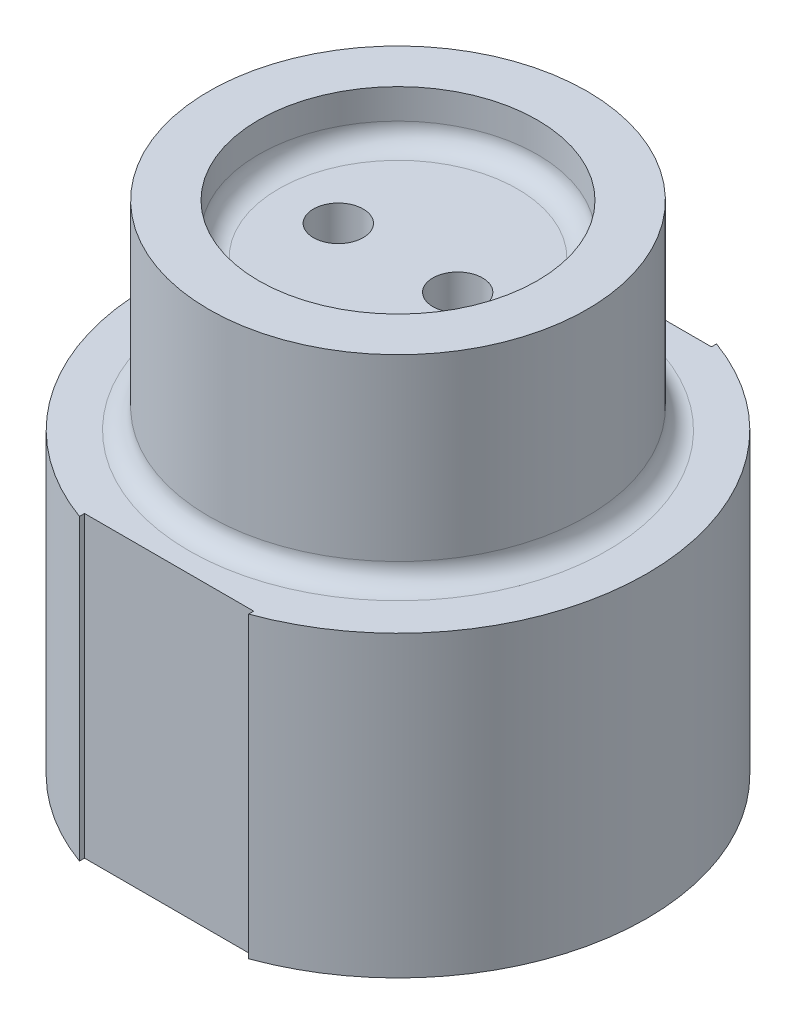
ISO-10303-21;
HEADER;
FILE_DESCRIPTION(('STEP AP214'),'2;1');
FILE_NAME('part.step','',(''),(''),'','','');
FILE_SCHEMA(('AUTOMOTIVE_DESIGN { 1 0 10303 214 1 1 1 1 }'));
ENDSEC;
DATA;
#1=APPLICATION_CONTEXT('core data for automotive mechanical design processes');
#2=APPLICATION_PROTOCOL_DEFINITION('international standard','automotive_design',2000,#1);
#3=PRODUCT_CONTEXT('',#1,'mechanical');
#4=PRODUCT('Part','Part','',(#3));
#5=PRODUCT_RELATED_PRODUCT_CATEGORY('part','',(#4));
#6=PRODUCT_DEFINITION_FORMATION('','',#4);
#7=PRODUCT_DEFINITION_CONTEXT('part definition',#1,'design');
#8=PRODUCT_DEFINITION('design','',#6,#7);
#9=PRODUCT_DEFINITION_SHAPE('','',#8);
#10=(LENGTH_UNIT() NAMED_UNIT(*) SI_UNIT(.MILLI.,.METRE.));
#11=(NAMED_UNIT(*) PLANE_ANGLE_UNIT() SI_UNIT($,.RADIAN.));
#12=(NAMED_UNIT(*) SI_UNIT($,.STERADIAN.) SOLID_ANGLE_UNIT());
#13=UNCERTAINTY_MEASURE_WITH_UNIT(LENGTH_MEASURE(1.E-05),#10,'distance_accuracy_value','');
#14=(GEOMETRIC_REPRESENTATION_CONTEXT(3) GLOBAL_UNCERTAINTY_ASSIGNED_CONTEXT((#13)) GLOBAL_UNIT_ASSIGNED_CONTEXT((#10,
#11,#12)) REPRESENTATION_CONTEXT('',''));
#15=CARTESIAN_POINT('',(0.,0.,0.));
#16=DIRECTION('',(0.,0.,1.));
#17=DIRECTION('',(1.,0.,0.));
#18=AXIS2_PLACEMENT_3D('',#15,#16,#17);
#19=CARTESIAN_POINT('',(0.,0.,0.));
#20=DIRECTION('',(0.,-1.,0.));
#21=DIRECTION('',(0.,0.,-1.));
#22=AXIS2_PLACEMENT_3D('',#19,#20,#21);
#23=PLANE('',#22);
#24=CARTESIAN_POINT('',(-33.02,0.,0.));
#25=DIRECTION('',(0.,-1.,0.));
#26=DIRECTION('',(0.,0.,1.));
#27=AXIS2_PLACEMENT_3D('',#24,#25,#26);
#28=CIRCLE('',#27,6.35);
#29=CARTESIAN_POINT('',(-33.02,0.,6.35));
#30=VERTEX_POINT('',#29);
#31=EDGE_CURVE('E187',#30,#30,#28,.T.);
#32=ORIENTED_EDGE('',*,*,#31,.F.);
#33=EDGE_LOOP('',(#32));
#34=FACE_BOUND('',#33,.T.);
#35=CARTESIAN_POINT('',(33.02,0.,0.));
#36=DIRECTION('',(0.,1.,0.));
#37=DIRECTION('',(0.,0.,1.));
#38=AXIS2_PLACEMENT_3D('',#35,#36,#37);
#39=CIRCLE('',#38,6.35);
#40=CARTESIAN_POINT('',(33.02,0.,6.35));
#41=VERTEX_POINT('',#40);
#42=EDGE_CURVE('E212',#41,#41,#39,.T.);
#43=ORIENTED_EDGE('',*,*,#42,.T.);
#44=EDGE_LOOP('',(#43));
#45=FACE_BOUND('',#44,.T.);
#46=CARTESIAN_POINT('',(0.,0.,0.));
#47=DIRECTION('',(0.,-1.,0.));
#48=DIRECTION('',(0.,0.,-1.));
#49=AXIS2_PLACEMENT_3D('',#46,#47,#48);
#50=CIRCLE('',#49,63.5);
#51=CARTESIAN_POINT('',(-21.59,0.,59.7170151631844));
#52=VERTEX_POINT('',#51);
#53=CARTESIAN_POINT('',(-21.59,0.,-59.7170151631844));
#54=VERTEX_POINT('',#53);
#55=EDGE_CURVE('E265',#52,#54,#50,.T.);
#56=ORIENTED_EDGE('',*,*,#55,.T.);
#57=DIRECTION('',(0.,0.,-1.));
#58=VECTOR('',#57,1.);
#59=CARTESIAN_POINT('',(-21.59,0.,-58.42));
#60=LINE('',#59,#58);
#61=CARTESIAN_POINT('',(-21.59,0.,-58.42));
#62=VERTEX_POINT('',#61);
#63=EDGE_CURVE('E141',#62,#54,#60,.T.);
#64=ORIENTED_EDGE('',*,*,#63,.F.);
#65=DIRECTION('',(1.,0.,0.));
#66=VECTOR('',#65,1.);
#67=CARTESIAN_POINT('',(-21.59,0.,-58.42));
#68=LINE('',#67,#66);
#69=CARTESIAN_POINT('',(21.59,0.,-58.42));
#70=VERTEX_POINT('',#69);
#71=EDGE_CURVE('E123',#62,#70,#68,.T.);
#72=ORIENTED_EDGE('',*,*,#71,.T.);
#73=DIRECTION('',(0.,0.,-1.));
#74=VECTOR('',#73,1.);
#75=CARTESIAN_POINT('',(21.59,0.,-58.42));
#76=LINE('',#75,#74);
#77=CARTESIAN_POINT('',(21.59,0.,-59.7170151631844));
#78=VERTEX_POINT('',#77);
#79=EDGE_CURVE('E120',#70,#78,#76,.T.);
#80=ORIENTED_EDGE('',*,*,#79,.T.);
#81=CARTESIAN_POINT('',(21.59,0.,59.7170151631844));
#82=VERTEX_POINT('',#81);
#83=EDGE_CURVE('E264',#78,#82,#50,.T.);
#84=ORIENTED_EDGE('',*,*,#83,.T.);
#85=DIRECTION('',(0.,0.,1.));
#86=VECTOR('',#85,1.);
#87=CARTESIAN_POINT('',(21.59,0.,58.42));
#88=LINE('',#87,#86);
#89=CARTESIAN_POINT('',(21.59,0.,58.42));
#90=VERTEX_POINT('',#89);
#91=EDGE_CURVE('E173',#90,#82,#88,.T.);
#92=ORIENTED_EDGE('',*,*,#91,.F.);
#93=DIRECTION('',(1.,0.,0.));
#94=VECTOR('',#93,1.);
#95=CARTESIAN_POINT('',(-21.59,0.,58.42));
#96=LINE('',#95,#94);
#97=CARTESIAN_POINT('',(-21.59,0.,58.42));
#98=VERTEX_POINT('',#97);
#99=EDGE_CURVE('E157',#98,#90,#96,.T.);
#100=ORIENTED_EDGE('',*,*,#99,.F.);
#101=DIRECTION('',(0.,0.,1.));
#102=VECTOR('',#101,1.);
#103=CARTESIAN_POINT('',(-21.59,0.,58.42));
#104=LINE('',#103,#102);
#105=EDGE_CURVE('E165',#98,#52,#104,.T.);
#106=ORIENTED_EDGE('',*,*,#105,.T.);
#107=EDGE_LOOP('',(#56,#64,#72,#80,#84,#92,#100,#106));
#108=FACE_BOUND('',#107,.T.);
#109=ADVANCED_FACE('F46',(#34,#45,#108),#23,.T.);
#110=CARTESIAN_POINT('',(0.,0.,0.));
#111=DIRECTION('',(0.,-1.,0.));
#112=DIRECTION('',(0.,0.,-1.));
#113=AXIS2_PLACEMENT_3D('',#110,#111,#112);
#114=CYLINDRICAL_SURFACE('',#113,63.5);
#115=CARTESIAN_POINT('',(0.,76.2,0.));
#116=DIRECTION('',(0.,-1.,0.));
#117=DIRECTION('',(0.,0.,-1.));
#118=AXIS2_PLACEMENT_3D('',#115,#116,#117);
#119=CIRCLE('',#118,63.5);
#120=CARTESIAN_POINT('',(-21.59,76.2,59.7170151631844));
#121=VERTEX_POINT('',#120);
#122=CARTESIAN_POINT('',(-21.59,76.2,-59.7170151631844));
#123=VERTEX_POINT('',#122);
#124=EDGE_CURVE('E260',#121,#123,#119,.T.);
#125=ORIENTED_EDGE('',*,*,#124,.T.);
#126=DIRECTION('',(0.,-1.,0.));
#127=VECTOR('',#126,1.);
#128=CARTESIAN_POINT('',(-21.59,0.,-59.7170151631844));
#129=LINE('',#128,#127);
#130=EDGE_CURVE('E149',#123,#54,#129,.T.);
#131=ORIENTED_EDGE('',*,*,#130,.T.);
#132=ORIENTED_EDGE('',*,*,#55,.F.);
#133=DIRECTION('',(0.,-1.,0.));
#134=VECTOR('',#133,1.);
#135=CARTESIAN_POINT('',(-21.59,0.,59.7170151631844));
#136=LINE('',#135,#134);
#137=EDGE_CURVE('E183',#121,#52,#136,.T.);
#138=ORIENTED_EDGE('',*,*,#137,.F.);
#139=EDGE_LOOP('',(#125,#131,#132,#138));
#140=FACE_BOUND('',#139,.T.);
#141=ADVANCED_FACE('F304',(#140),#114,.T.);
#142=ORIENTED_EDGE('',*,*,#83,.F.);
#143=DIRECTION('',(0.,-1.,0.));
#144=VECTOR('',#143,1.);
#145=CARTESIAN_POINT('',(21.59,0.,-59.7170151631844));
#146=LINE('',#145,#144);
#147=CARTESIAN_POINT('',(21.59,76.2,-59.7170151631844));
#148=VERTEX_POINT('',#147);
#149=EDGE_CURVE('E146',#78,#148,#146,.F.);
#150=ORIENTED_EDGE('',*,*,#149,.T.);
#151=CARTESIAN_POINT('',(21.59,76.2,59.7170151631844));
#152=VERTEX_POINT('',#151);
#153=EDGE_CURVE('E135',#148,#152,#119,.T.);
#154=ORIENTED_EDGE('',*,*,#153,.T.);
#155=DIRECTION('',(0.,-1.,0.));
#156=VECTOR('',#155,1.);
#157=CARTESIAN_POINT('',(21.59,0.,59.7170151631844));
#158=LINE('',#157,#156);
#159=EDGE_CURVE('E169',#82,#152,#158,.F.);
#160=ORIENTED_EDGE('',*,*,#159,.F.);
#161=EDGE_LOOP('',(#142,#150,#154,#160));
#162=FACE_BOUND('',#161,.T.);
#163=ADVANCED_FACE('F311',(#162),#114,.T.);
#164=CARTESIAN_POINT('',(63.5,76.2,0.));
#165=DIRECTION('',(0.,1.,0.));
#166=DIRECTION('',(0.,0.,1.));
#167=AXIS2_PLACEMENT_3D('',#164,#165,#166);
#168=PLANE('',#167);
#169=CARTESIAN_POINT('',(0.,76.2,0.));
#170=DIRECTION('',(0.,1.,0.));
#171=DIRECTION('',(0.,0.,1.));
#172=AXIS2_PLACEMENT_3D('',#169,#170,#171);
#173=CIRCLE('',#172,53.34);
#174=CARTESIAN_POINT('',(0.,76.2,53.34));
#175=VERTEX_POINT('',#174);
#176=EDGE_CURVE('E56',#175,#175,#173,.F.);
#177=ORIENTED_EDGE('',*,*,#176,.T.);
#178=EDGE_LOOP('',(#177));
#179=FACE_BOUND('',#178,.T.);
#180=DIRECTION('',(-1.,0.,0.));
#181=VECTOR('',#180,1.);
#182=CARTESIAN_POINT('',(-21.59,76.2,-58.42));
#183=LINE('',#182,#181);
#184=CARTESIAN_POINT('',(21.59,76.2,-58.42));
#185=VERTEX_POINT('',#184);
#186=CARTESIAN_POINT('',(-21.59,76.2,-58.42));
#187=VERTEX_POINT('',#186);
#188=EDGE_CURVE('E124',#185,#187,#183,.T.);
#189=ORIENTED_EDGE('',*,*,#188,.T.);
#190=DIRECTION('',(0.,0.,-1.));
#191=VECTOR('',#190,1.);
#192=CARTESIAN_POINT('',(-21.59,76.2,-58.42));
#193=LINE('',#192,#191);
#194=EDGE_CURVE('E137',#187,#123,#193,.T.);
#195=ORIENTED_EDGE('',*,*,#194,.T.);
#196=ORIENTED_EDGE('',*,*,#124,.F.);
#197=DIRECTION('',(0.,0.,1.));
#198=VECTOR('',#197,1.);
#199=CARTESIAN_POINT('',(-21.59,76.2,58.42));
#200=LINE('',#199,#198);
#201=CARTESIAN_POINT('',(-21.59,76.2,58.42));
#202=VERTEX_POINT('',#201);
#203=EDGE_CURVE('E166',#202,#121,#200,.T.);
#204=ORIENTED_EDGE('',*,*,#203,.F.);
#205=DIRECTION('',(-1.,0.,0.));
#206=VECTOR('',#205,1.);
#207=CARTESIAN_POINT('',(-21.59,76.2,58.42));
#208=LINE('',#207,#206);
#209=CARTESIAN_POINT('',(21.59,76.2,58.42));
#210=VERTEX_POINT('',#209);
#211=EDGE_CURVE('E162',#210,#202,#208,.T.);
#212=ORIENTED_EDGE('',*,*,#211,.F.);
#213=DIRECTION('',(0.,0.,1.));
#214=VECTOR('',#213,1.);
#215=CARTESIAN_POINT('',(21.59,76.2,58.42));
#216=LINE('',#215,#214);
#217=EDGE_CURVE('E170',#210,#152,#216,.T.);
#218=ORIENTED_EDGE('',*,*,#217,.T.);
#219=ORIENTED_EDGE('',*,*,#153,.F.);
#220=DIRECTION('',(0.,0.,-1.));
#221=VECTOR('',#220,1.);
#222=CARTESIAN_POINT('',(21.59,76.2,-58.42));
#223=LINE('',#222,#221);
#224=EDGE_CURVE('E117',#185,#148,#223,.T.);
#225=ORIENTED_EDGE('',*,*,#224,.F.);
#226=EDGE_LOOP('',(#189,#195,#196,#204,#212,#218,#219,#225));
#227=FACE_BOUND('',#226,.T.);
#228=ADVANCED_FACE('F133',(#179,#227),#168,.T.);
#229=CARTESIAN_POINT('',(15.24,114.3,0.));
#230=DIRECTION('',(0.,-1.,0.));
#231=DIRECTION('',(1.,0.,0.));
#232=AXIS2_PLACEMENT_3D('',#229,#230,#231);
#233=CYLINDRICAL_SURFACE('',#232,6.35);
#234=CARTESIAN_POINT('',(15.24,50.8,0.));
#235=DIRECTION('',(0.707106781186548,-0.707106781186548,0.));
#236=DIRECTION('',(-0.707106781186548,-0.707106781186548,0.));
#237=AXIS2_PLACEMENT_3D('',#234,#235,#236);
#238=ELLIPSE('',#237,8.98025612106915,6.35);
#239=CARTESIAN_POINT('',(8.89,44.45,0.));
#240=VERTEX_POINT('',#239);
#241=EDGE_CURVE('E217',#240,#240,#238,.F.);
#242=ORIENTED_EDGE('',*,*,#241,.F.);
#243=EDGE_LOOP('',(#242));
#244=FACE_BOUND('',#243,.T.);
#245=CARTESIAN_POINT('',(15.24,114.3,0.));
#246=DIRECTION('',(0.,1.,0.));
#247=DIRECTION('',(0.,0.,1.));
#248=AXIS2_PLACEMENT_3D('',#245,#246,#247);
#249=CIRCLE('',#248,6.35);
#250=CARTESIAN_POINT('',(15.24,114.3,6.35));
#251=VERTEX_POINT('',#250);
#252=EDGE_CURVE('E196',#251,#251,#249,.T.);
#253=ORIENTED_EDGE('',*,*,#252,.T.);
#254=EDGE_LOOP('',(#253));
#255=FACE_BOUND('',#254,.T.);
#256=ADVANCED_FACE('F319',(#244,#255),#233,.F.);
#257=CARTESIAN_POINT('',(1.17,50.8,0.));
#258=DIRECTION('',(1.,0.,0.));
#259=DIRECTION('',(0.,0.,-1.));
#260=AXIS2_PLACEMENT_3D('',#257,#258,#259);
#261=CYLINDRICAL_SURFACE('',#260,6.35);
#262=ORIENTED_EDGE('',*,*,#241,.T.);
#263=EDGE_LOOP('',(#262));
#264=FACE_BOUND('',#263,.T.);
#265=CARTESIAN_POINT('',(33.02,50.8,0.));
#266=DIRECTION('',(0.707106781186548,-0.707106781186547,0.));
#267=DIRECTION('',(0.707106781186547,0.707106781186548,0.));
#268=AXIS2_PLACEMENT_3D('',#265,#266,#267);
#269=ELLIPSE('',#268,8.98025612106915,6.35);
#270=CARTESIAN_POINT('',(39.37,57.15,0.));
#271=VERTEX_POINT('',#270);
#272=EDGE_CURVE('E222',#271,#271,#269,.F.);
#273=ORIENTED_EDGE('',*,*,#272,.F.);
#274=EDGE_LOOP('',(#273));
#275=FACE_BOUND('',#274,.T.);
#276=ADVANCED_FACE('F371',(#264,#275),#261,.F.);
#277=CARTESIAN_POINT('',(33.02,64.87,0.));
#278=DIRECTION('',(0.,-1.,0.));
#279=DIRECTION('',(1.,0.,0.));
#280=AXIS2_PLACEMENT_3D('',#277,#278,#279);
#281=CYLINDRICAL_SURFACE('',#280,6.35);
#282=ORIENTED_EDGE('',*,*,#272,.T.);
#283=EDGE_LOOP('',(#282));
#284=FACE_BOUND('',#283,.T.);
#285=ORIENTED_EDGE('',*,*,#42,.F.);
#286=EDGE_LOOP('',(#285));
#287=FACE_BOUND('',#286,.T.);
#288=ADVANCED_FACE('F324',(#284,#287),#281,.F.);
#289=CARTESIAN_POINT('',(0.,0.,0.));
#290=DIRECTION('',(0.,-1.,0.));
#291=DIRECTION('',(0.,0.,-1.));
#292=AXIS2_PLACEMENT_3D('',#289,#290,#291);
#293=CYLINDRICAL_SURFACE('',#292,48.26);
#294=CARTESIAN_POINT('',(0.,81.28,0.));
#295=DIRECTION('',(0.,1.,0.));
#296=DIRECTION('',(0.,0.,1.));
#297=AXIS2_PLACEMENT_3D('',#294,#295,#296);
#298=CIRCLE('',#297,48.26);
#299=CARTESIAN_POINT('',(0.,81.28,48.26));
#300=VERTEX_POINT('',#299);
#301=EDGE_CURVE('E11',#300,#300,#298,.T.);
#302=ORIENTED_EDGE('',*,*,#301,.T.);
#303=EDGE_LOOP('',(#302));
#304=FACE_BOUND('',#303,.T.);
#305=CARTESIAN_POINT('',(0.,127.,0.));
#306=DIRECTION('',(0.,-1.,0.));
#307=DIRECTION('',(0.,0.,-1.));
#308=AXIS2_PLACEMENT_3D('',#305,#306,#307);
#309=CIRCLE('',#308,48.26);
#310=CARTESIAN_POINT('',(0.,127.,-48.26));
#311=VERTEX_POINT('',#310);
#312=EDGE_CURVE('E256',#311,#311,#309,.T.);
#313=ORIENTED_EDGE('',*,*,#312,.T.);
#314=EDGE_LOOP('',(#313));
#315=FACE_BOUND('',#314,.T.);
#316=ADVANCED_FACE('F320',(#304,#315),#293,.T.);
#317=CARTESIAN_POINT('',(35.56,127.,0.));
#318=DIRECTION('',(0.,1.,0.));
#319=DIRECTION('',(0.,0.,1.));
#320=AXIS2_PLACEMENT_3D('',#317,#318,#319);
#321=PLANE('',#320);
#322=CARTESIAN_POINT('',(0.,127.,0.));
#323=DIRECTION('',(0.,-1.,0.));
#324=DIRECTION('',(0.,0.,-1.));
#325=AXIS2_PLACEMENT_3D('',#322,#323,#324);
#326=CIRCLE('',#325,35.56);
#327=CARTESIAN_POINT('',(0.,127.,-35.56));
#328=VERTEX_POINT('',#327);
#329=EDGE_CURVE('E252',#328,#328,#326,.T.);
#330=ORIENTED_EDGE('',*,*,#329,.T.);
#331=EDGE_LOOP('',(#330));
#332=FACE_BOUND('',#331,.T.);
#333=ORIENTED_EDGE('',*,*,#312,.F.);
#334=EDGE_LOOP('',(#333));
#335=FACE_BOUND('',#334,.T.);
#336=ADVANCED_FACE('F323',(#332,#335),#321,.T.);
#337=CARTESIAN_POINT('',(0.,0.,0.));
#338=DIRECTION('',(0.,-1.,0.));
#339=DIRECTION('',(0.,0.,-1.));
#340=AXIS2_PLACEMENT_3D('',#337,#338,#339);
#341=CYLINDRICAL_SURFACE('',#340,35.56);
#342=CARTESIAN_POINT('',(0.,119.38,0.));
#343=DIRECTION('',(0.,1.,0.));
#344=DIRECTION('',(0.,0.,1.));
#345=AXIS2_PLACEMENT_3D('',#342,#343,#344);
#346=CIRCLE('',#345,35.56);
#347=CARTESIAN_POINT('',(0.,119.38,35.56));
#348=VERTEX_POINT('',#347);
#349=EDGE_CURVE('E287',#348,#348,#346,.F.);
#350=ORIENTED_EDGE('',*,*,#349,.T.);
#351=EDGE_LOOP('',(#350));
#352=FACE_BOUND('',#351,.T.);
#353=ORIENTED_EDGE('',*,*,#329,.F.);
#354=EDGE_LOOP('',(#353));
#355=FACE_BOUND('',#354,.T.);
#356=ADVANCED_FACE('F328',(#352,#355),#341,.F.);
#357=CARTESIAN_POINT('',(0.,114.3,0.));
#358=DIRECTION('',(0.,1.,0.));
#359=DIRECTION('',(0.,0.,1.));
#360=AXIS2_PLACEMENT_3D('',#357,#358,#359);
#361=PLANE('',#360);
#362=CARTESIAN_POINT('',(0.,114.3,0.));
#363=DIRECTION('',(0.,1.,0.));
#364=DIRECTION('',(0.,0.,1.));
#365=AXIS2_PLACEMENT_3D('',#362,#363,#364);
#366=CIRCLE('',#365,30.48);
#367=CARTESIAN_POINT('',(0.,114.3,30.48));
#368=VERTEX_POINT('',#367);
#369=EDGE_CURVE('E280',#368,#368,#366,.T.);
#370=ORIENTED_EDGE('',*,*,#369,.T.);
#371=EDGE_LOOP('',(#370));
#372=FACE_BOUND('',#371,.T.);
#373=CARTESIAN_POINT('',(-15.24,114.3,0.));
#374=DIRECTION('',(0.,1.,0.));
#375=DIRECTION('',(0.,0.,1.));
#376=AXIS2_PLACEMENT_3D('',#373,#374,#375);
#377=CIRCLE('',#376,6.35);
#378=CARTESIAN_POINT('',(-15.24,114.3,6.35));
#379=VERTEX_POINT('',#378);
#380=EDGE_CURVE('E186',#379,#379,#377,.F.);
#381=ORIENTED_EDGE('',*,*,#380,.T.);
#382=EDGE_LOOP('',(#381));
#383=FACE_BOUND('',#382,.T.);
#384=ORIENTED_EDGE('',*,*,#252,.F.);
#385=EDGE_LOOP('',(#384));
#386=FACE_BOUND('',#385,.T.);
#387=ADVANCED_FACE('F332',(#372,#383,#386),#361,.T.);
#388=CARTESIAN_POINT('',(-15.24,114.3,0.));
#389=DIRECTION('',(0.,-1.,0.));
#390=DIRECTION('',(1.,0.,0.));
#391=AXIS2_PLACEMENT_3D('',#388,#389,#390);
#392=CYLINDRICAL_SURFACE('',#391,6.35);
#393=CARTESIAN_POINT('',(-15.24,50.8,0.));
#394=DIRECTION('',(-0.707106781186548,-0.707106781186548,0.));
#395=DIRECTION('',(0.707106781186548,-0.707106781186548,0.));
#396=AXIS2_PLACEMENT_3D('',#393,#394,#395);
#397=ELLIPSE('',#396,8.98025612106915,6.35);
#398=CARTESIAN_POINT('',(-8.89,44.45,0.));
#399=VERTEX_POINT('',#398);
#400=EDGE_CURVE('E192',#399,#399,#397,.F.);
#401=ORIENTED_EDGE('',*,*,#400,.F.);
#402=EDGE_LOOP('',(#401));
#403=FACE_BOUND('',#402,.T.);
#404=ORIENTED_EDGE('',*,*,#380,.F.);
#405=EDGE_LOOP('',(#404));
#406=FACE_BOUND('',#405,.T.);
#407=ADVANCED_FACE('F351',(#403,#406),#392,.F.);
#408=CARTESIAN_POINT('',(-1.17,50.8,0.));
#409=DIRECTION('',(-1.,0.,0.));
#410=DIRECTION('',(0.,0.,1.));
#411=AXIS2_PLACEMENT_3D('',#408,#409,#410);
#412=CYLINDRICAL_SURFACE('',#411,6.35);
#413=ORIENTED_EDGE('',*,*,#400,.T.);
#414=EDGE_LOOP('',(#413));
#415=FACE_BOUND('',#414,.T.);
#416=CARTESIAN_POINT('',(-33.02,50.8,0.));
#417=DIRECTION('',(-0.707106781186548,-0.707106781186547,0.));
#418=DIRECTION('',(-0.707106781186547,0.707106781186548,0.));
#419=AXIS2_PLACEMENT_3D('',#416,#417,#418);
#420=ELLIPSE('',#419,8.98025612106915,6.35);
#421=CARTESIAN_POINT('',(-39.37,57.15,0.));
#422=VERTEX_POINT('',#421);
#423=EDGE_CURVE('E197',#422,#422,#420,.F.);
#424=ORIENTED_EDGE('',*,*,#423,.F.);
#425=EDGE_LOOP('',(#424));
#426=FACE_BOUND('',#425,.T.);
#427=ADVANCED_FACE('F394',(#415,#426),#412,.F.);
#428=CARTESIAN_POINT('',(-33.02,64.87,0.));
#429=DIRECTION('',(0.,-1.,0.));
#430=DIRECTION('',(1.,0.,0.));
#431=AXIS2_PLACEMENT_3D('',#428,#429,#430);
#432=CYLINDRICAL_SURFACE('',#431,6.35);
#433=ORIENTED_EDGE('',*,*,#423,.T.);
#434=EDGE_LOOP('',(#433));
#435=FACE_BOUND('',#434,.T.);
#436=ORIENTED_EDGE('',*,*,#31,.T.);
#437=EDGE_LOOP('',(#436));
#438=FACE_BOUND('',#437,.T.);
#439=ADVANCED_FACE('F390',(#435,#438),#432,.F.);
#440=CARTESIAN_POINT('',(-21.59,0.,58.42));
#441=DIRECTION('',(-1.,0.,0.));
#442=DIRECTION('',(0.,0.,1.));
#443=AXIS2_PLACEMENT_3D('',#440,#441,#442);
#444=PLANE('',#443);
#445=ORIENTED_EDGE('',*,*,#137,.T.);
#446=ORIENTED_EDGE('',*,*,#105,.F.);
#447=DIRECTION('',(0.,-1.,0.));
#448=VECTOR('',#447,1.);
#449=CARTESIAN_POINT('',(-21.59,0.,58.42));
#450=LINE('',#449,#448);
#451=EDGE_CURVE('E153',#202,#98,#450,.T.);
#452=ORIENTED_EDGE('',*,*,#451,.F.);
#453=ORIENTED_EDGE('',*,*,#203,.T.);
#454=EDGE_LOOP('',(#445,#446,#452,#453));
#455=FACE_BOUND('',#454,.T.);
#456=ADVANCED_FACE('F393',(#455),#444,.F.);
#457=CARTESIAN_POINT('',(21.59,0.,58.42));
#458=DIRECTION('',(1.,0.,0.));
#459=DIRECTION('',(0.,1.,0.));
#460=AXIS2_PLACEMENT_3D('',#457,#458,#459);
#461=PLANE('',#460);
#462=ORIENTED_EDGE('',*,*,#159,.T.);
#463=ORIENTED_EDGE('',*,*,#217,.F.);
#464=DIRECTION('',(0.,1.,0.));
#465=VECTOR('',#464,1.);
#466=CARTESIAN_POINT('',(21.59,0.,58.42));
#467=LINE('',#466,#465);
#468=EDGE_CURVE('E71',#90,#210,#467,.T.);
#469=ORIENTED_EDGE('',*,*,#468,.F.);
#470=ORIENTED_EDGE('',*,*,#91,.T.);
#471=EDGE_LOOP('',(#462,#463,#469,#470));
#472=FACE_BOUND('',#471,.T.);
#473=ADVANCED_FACE('F404',(#472),#461,.F.);
#474=CARTESIAN_POINT('',(0.,0.,58.42));
#475=DIRECTION('',(0.,0.,-1.));
#476=DIRECTION('',(-1.,0.,0.));
#477=AXIS2_PLACEMENT_3D('',#474,#475,#476);
#478=PLANE('',#477);
#479=ORIENTED_EDGE('',*,*,#451,.T.);
#480=ORIENTED_EDGE('',*,*,#99,.T.);
#481=ORIENTED_EDGE('',*,*,#468,.T.);
#482=ORIENTED_EDGE('',*,*,#211,.T.);
#483=EDGE_LOOP('',(#479,#480,#481,#482));
#484=FACE_BOUND('',#483,.T.);
#485=ADVANCED_FACE('F408',(#484),#478,.F.);
#486=CARTESIAN_POINT('',(-21.59,0.,-58.42));
#487=DIRECTION('',(1.,0.,0.));
#488=DIRECTION('',(0.,0.,-1.));
#489=AXIS2_PLACEMENT_3D('',#486,#487,#488);
#490=PLANE('',#489);
#491=ORIENTED_EDGE('',*,*,#194,.F.);
#492=DIRECTION('',(0.,-1.,0.));
#493=VECTOR('',#492,1.);
#494=CARTESIAN_POINT('',(-21.59,0.,-58.42));
#495=LINE('',#494,#493);
#496=EDGE_CURVE('E63',#187,#62,#495,.T.);
#497=ORIENTED_EDGE('',*,*,#496,.T.);
#498=ORIENTED_EDGE('',*,*,#63,.T.);
#499=ORIENTED_EDGE('',*,*,#130,.F.);
#500=EDGE_LOOP('',(#491,#497,#498,#499));
#501=FACE_BOUND('',#500,.T.);
#502=ADVANCED_FACE('F411',(#501),#490,.T.);
#503=CARTESIAN_POINT('',(21.59,0.,-58.42));
#504=DIRECTION('',(-1.,0.,0.));
#505=DIRECTION('',(0.,-1.,0.));
#506=AXIS2_PLACEMENT_3D('',#503,#504,#505);
#507=PLANE('',#506);
#508=ORIENTED_EDGE('',*,*,#79,.F.);
#509=DIRECTION('',(0.,1.,0.));
#510=VECTOR('',#509,1.);
#511=CARTESIAN_POINT('',(21.59,0.,-58.42));
#512=LINE('',#511,#510);
#513=EDGE_CURVE('E114',#70,#185,#512,.T.);
#514=ORIENTED_EDGE('',*,*,#513,.T.);
#515=ORIENTED_EDGE('',*,*,#224,.T.);
#516=ORIENTED_EDGE('',*,*,#149,.F.);
#517=EDGE_LOOP('',(#508,#514,#515,#516));
#518=FACE_BOUND('',#517,.T.);
#519=ADVANCED_FACE('F115',(#518),#507,.T.);
#520=CARTESIAN_POINT('',(0.,0.,-58.42));
#521=DIRECTION('',(0.,0.,1.));
#522=DIRECTION('',(-1.,0.,0.));
#523=AXIS2_PLACEMENT_3D('',#520,#521,#522);
#524=PLANE('',#523);
#525=ORIENTED_EDGE('',*,*,#496,.F.);
#526=ORIENTED_EDGE('',*,*,#188,.F.);
#527=ORIENTED_EDGE('',*,*,#513,.F.);
#528=ORIENTED_EDGE('',*,*,#71,.F.);
#529=EDGE_LOOP('',(#525,#526,#527,#528));
#530=FACE_BOUND('',#529,.T.);
#531=ADVANCED_FACE('F127',(#530),#524,.F.);
#532=CARTESIAN_POINT('',(0.,119.38,0.));
#533=DIRECTION('',(0.,1.,0.));
#534=DIRECTION('',(0.,0.,1.));
#535=AXIS2_PLACEMENT_3D('',#532,#533,#534);
#536=TOROIDAL_SURFACE('',#535,30.48,5.08);
#537=ORIENTED_EDGE('',*,*,#349,.F.);
#538=EDGE_LOOP('',(#537));
#539=FACE_BOUND('',#538,.T.);
#540=ORIENTED_EDGE('',*,*,#369,.F.);
#541=EDGE_LOOP('',(#540));
#542=FACE_BOUND('',#541,.T.);
#543=ADVANCED_FACE('F296',(#539,#542),#536,.F.);
#544=CARTESIAN_POINT('',(0.,81.28,0.));
#545=DIRECTION('',(0.,1.,0.));
#546=DIRECTION('',(0.,0.,1.));
#547=AXIS2_PLACEMENT_3D('',#544,#545,#546);
#548=TOROIDAL_SURFACE('',#547,53.34,5.08);
#549=ORIENTED_EDGE('',*,*,#301,.F.);
#550=EDGE_LOOP('',(#549));
#551=FACE_BOUND('',#550,.T.);
#552=ORIENTED_EDGE('',*,*,#176,.F.);
#553=EDGE_LOOP('',(#552));
#554=FACE_BOUND('',#553,.T.);
#555=ADVANCED_FACE('F48',(#551,#554),#548,.F.);
#556=CLOSED_SHELL('',(#109,#141,#163,#228,#256,#276,#288,#316,#336,#356,#387,#407,#427,#439,
#456,#473,#485,#502,#519,#531,#543,#555));
#557=CARTESIAN_POINT('',(0.,109.22,0.));
#558=DIRECTION('',(0.,1.,0.));
#559=DIRECTION('',(0.,0.,1.));
#560=AXIS2_PLACEMENT_3D('',#557,#558,#559);
#561=PLANE('',#560);
#562=CARTESIAN_POINT('',(15.24,109.22,0.));
#563=DIRECTION('',(0.,1.,0.));
#564=DIRECTION('',(0.,0.,1.));
#565=AXIS2_PLACEMENT_3D('',#562,#563,#564);
#566=CIRCLE('',#565,8.89);
#567=CARTESIAN_POINT('',(15.24,109.22,8.89));
#568=VERTEX_POINT('',#567);
#569=EDGE_CURVE('E269',#568,#568,#566,.F.);
#570=ORIENTED_EDGE('',*,*,#569,.F.);
#571=EDGE_LOOP('',(#570));
#572=FACE_BOUND('',#571,.T.);
#573=CARTESIAN_POINT('',(0.,109.22,0.));
#574=DIRECTION('',(0.,1.,0.));
#575=DIRECTION('',(0.,0.,1.));
#576=AXIS2_PLACEMENT_3D('',#573,#574,#575);
#577=CIRCLE('',#576,35.56);
#578=CARTESIAN_POINT('',(0.,109.22,35.56));
#579=VERTEX_POINT('',#578);
#580=EDGE_CURVE('E221',#579,#579,#577,.T.);
#581=ORIENTED_EDGE('',*,*,#580,.F.);
#582=EDGE_LOOP('',(#581));
#583=FACE_BOUND('',#582,.T.);
#584=CARTESIAN_POINT('',(-15.24,109.22,0.));
#585=DIRECTION('',(0.,1.,0.));
#586=DIRECTION('',(0.,0.,1.));
#587=AXIS2_PLACEMENT_3D('',#584,#585,#586);
#588=CIRCLE('',#587,8.89);
#589=CARTESIAN_POINT('',(-15.24,109.22,8.89));
#590=VERTEX_POINT('',#589);
#591=EDGE_CURVE('E273',#590,#590,#588,.F.);
#592=ORIENTED_EDGE('',*,*,#591,.F.);
#593=EDGE_LOOP('',(#592));
#594=FACE_BOUND('',#593,.T.);
#595=ADVANCED_FACE('F347',(#572,#583,#594),#561,.F.);
#596=CARTESIAN_POINT('',(0.,12.7,0.));
#597=DIRECTION('',(0.,1.,0.));
#598=DIRECTION('',(0.,0.,1.));
#599=AXIS2_PLACEMENT_3D('',#596,#597,#598);
#600=PLANE('',#599);
#601=CARTESIAN_POINT('',(33.02,12.7,0.));
#602=DIRECTION('',(0.,1.,0.));
#603=DIRECTION('',(0.,0.,1.));
#604=AXIS2_PLACEMENT_3D('',#601,#602,#603);
#605=CIRCLE('',#604,8.89);
#606=CARTESIAN_POINT('',(33.02,12.7,8.89));
#607=VERTEX_POINT('',#606);
#608=EDGE_CURVE('E226',#607,#607,#605,.T.);
#609=ORIENTED_EDGE('',*,*,#608,.F.);
#610=EDGE_LOOP('',(#609));
#611=FACE_BOUND('',#610,.T.);
#612=CARTESIAN_POINT('',(0.,12.7,0.));
#613=DIRECTION('',(0.,-1.,0.));
#614=DIRECTION('',(0.,0.,-1.));
#615=AXIS2_PLACEMENT_3D('',#612,#613,#614);
#616=CIRCLE('',#615,50.8);
#617=CARTESIAN_POINT('',(0.,12.7,-50.8));
#618=VERTEX_POINT('',#617);
#619=EDGE_CURVE('E240',#618,#618,#616,.T.);
#620=ORIENTED_EDGE('',*,*,#619,.F.);
#621=EDGE_LOOP('',(#620));
#622=FACE_BOUND('',#621,.T.);
#623=CARTESIAN_POINT('',(-33.02,12.7,0.));
#624=DIRECTION('',(0.,-1.,0.));
#625=DIRECTION('',(0.,0.,1.));
#626=AXIS2_PLACEMENT_3D('',#623,#624,#625);
#627=CIRCLE('',#626,8.89);
#628=CARTESIAN_POINT('',(-33.02,12.7,8.89));
#629=VERTEX_POINT('',#628);
#630=EDGE_CURVE('E201',#629,#629,#627,.T.);
#631=ORIENTED_EDGE('',*,*,#630,.T.);
#632=EDGE_LOOP('',(#631));
#633=FACE_BOUND('',#632,.T.);
#634=ADVANCED_FACE('F343',(#611,#622,#633),#600,.T.);
#635=CARTESIAN_POINT('',(0.,0.,0.));
#636=DIRECTION('',(0.,-1.,0.));
#637=DIRECTION('',(0.,0.,-1.));
#638=AXIS2_PLACEMENT_3D('',#635,#636,#637);
#639=CYLINDRICAL_SURFACE('',#638,50.8);
#640=ORIENTED_EDGE('',*,*,#619,.T.);
#641=EDGE_LOOP('',(#640));
#642=FACE_BOUND('',#641,.T.);
#643=CARTESIAN_POINT('',(0.,63.5,0.));
#644=DIRECTION('',(0.,-1.,0.));
#645=DIRECTION('',(0.,0.,-1.));
#646=AXIS2_PLACEMENT_3D('',#643,#644,#645);
#647=CIRCLE('',#646,50.8);
#648=CARTESIAN_POINT('',(0.,63.5,-50.8));
#649=VERTEX_POINT('',#648);
#650=EDGE_CURVE('E244',#649,#649,#647,.T.);
#651=ORIENTED_EDGE('',*,*,#650,.F.);
#652=EDGE_LOOP('',(#651));
#653=FACE_BOUND('',#652,.T.);
#654=ADVANCED_FACE('F338',(#642,#653),#639,.F.);
#655=CARTESIAN_POINT('',(50.8,63.5,0.));
#656=DIRECTION('',(0.,-1.,0.));
#657=DIRECTION('',(0.,0.,-1.));
#658=AXIS2_PLACEMENT_3D('',#655,#656,#657);
#659=PLANE('',#658);
#660=ORIENTED_EDGE('',*,*,#650,.T.);
#661=EDGE_LOOP('',(#660));
#662=FACE_BOUND('',#661,.T.);
#663=CARTESIAN_POINT('',(0.,63.5,0.));
#664=DIRECTION('',(0.,-1.,0.));
#665=DIRECTION('',(0.,0.,-1.));
#666=AXIS2_PLACEMENT_3D('',#663,#664,#665);
#667=CIRCLE('',#666,35.56);
#668=CARTESIAN_POINT('',(0.,63.5,-35.56));
#669=VERTEX_POINT('',#668);
#670=EDGE_CURVE('E248',#669,#669,#667,.T.);
#671=ORIENTED_EDGE('',*,*,#670,.F.);
#672=EDGE_LOOP('',(#671));
#673=FACE_BOUND('',#672,.T.);
#674=ADVANCED_FACE('F335',(#662,#673),#659,.T.);
#675=ORIENTED_EDGE('',*,*,#670,.T.);
#676=EDGE_LOOP('',(#675));
#677=FACE_BOUND('',#676,.T.);
#678=ORIENTED_EDGE('',*,*,#580,.T.);
#679=EDGE_LOOP('',(#678));
#680=FACE_BOUND('',#679,.T.);
#681=ADVANCED_FACE('F334',(#677,#680),#341,.F.);
#682=CARTESIAN_POINT('',(15.24,114.3,0.));
#683=DIRECTION('',(0.,-1.,0.));
#684=DIRECTION('',(1.,0.,0.));
#685=AXIS2_PLACEMENT_3D('',#682,#683,#684);
#686=CYLINDRICAL_SURFACE('',#685,8.89);
#687=CARTESIAN_POINT('',(15.24,50.8,0.));
#688=DIRECTION('',(0.707106781186548,-0.707106781186548,0.));
#689=DIRECTION('',(-0.707106781186548,-0.707106781186548,0.));
#690=AXIS2_PLACEMENT_3D('',#687,#688,#689);
#691=ELLIPSE('',#690,12.5723585694968,8.89);
#692=CARTESIAN_POINT('',(6.35,41.91,0.));
#693=VERTEX_POINT('',#692);
#694=EDGE_CURVE('E230',#693,#693,#691,.T.);
#695=ORIENTED_EDGE('',*,*,#694,.F.);
#696=EDGE_LOOP('',(#695));
#697=FACE_BOUND('',#696,.T.);
#698=ORIENTED_EDGE('',*,*,#569,.T.);
#699=EDGE_LOOP('',(#698));
#700=FACE_BOUND('',#699,.T.);
#701=ADVANCED_FACE('F360',(#697,#700),#686,.T.);
#702=CARTESIAN_POINT('',(33.02,70.458,0.));
#703=DIRECTION('',(0.,-1.,0.));
#704=DIRECTION('',(1.,0.,0.));
#705=AXIS2_PLACEMENT_3D('',#702,#703,#704);
#706=CYLINDRICAL_SURFACE('',#705,8.89);
#707=CARTESIAN_POINT('',(33.02,50.8,0.));
#708=DIRECTION('',(0.707106781186548,-0.707106781186547,0.));
#709=DIRECTION('',(0.707106781186547,0.707106781186548,0.));
#710=AXIS2_PLACEMENT_3D('',#707,#708,#709);
#711=ELLIPSE('',#710,12.5723585694968,8.89);
#712=CARTESIAN_POINT('',(41.91,59.69,0.));
#713=VERTEX_POINT('',#712);
#714=EDGE_CURVE('E216',#713,#713,#711,.T.);
#715=ORIENTED_EDGE('',*,*,#714,.T.);
#716=EDGE_LOOP('',(#715));
#717=FACE_BOUND('',#716,.T.);
#718=ORIENTED_EDGE('',*,*,#608,.T.);
#719=EDGE_LOOP('',(#718));
#720=FACE_BOUND('',#719,.T.);
#721=ADVANCED_FACE('F356',(#717,#720),#706,.T.);
#722=CARTESIAN_POINT('',(-4.41800000000001,50.8,0.));
#723=DIRECTION('',(1.,0.,0.));
#724=DIRECTION('',(0.,0.,-1.));
#725=AXIS2_PLACEMENT_3D('',#722,#723,#724);
#726=CYLINDRICAL_SURFACE('',#725,8.89);
#727=ORIENTED_EDGE('',*,*,#694,.T.);
#728=EDGE_LOOP('',(#727));
#729=FACE_BOUND('',#728,.T.);
#730=ORIENTED_EDGE('',*,*,#714,.F.);
#731=EDGE_LOOP('',(#730));
#732=FACE_BOUND('',#731,.T.);
#733=ADVANCED_FACE('F359',(#729,#732),#726,.T.);
#734=CARTESIAN_POINT('',(-15.24,114.3,0.));
#735=DIRECTION('',(0.,-1.,0.));
#736=DIRECTION('',(1.,0.,0.));
#737=AXIS2_PLACEMENT_3D('',#734,#735,#736);
#738=CYLINDRICAL_SURFACE('',#737,8.89);
#739=CARTESIAN_POINT('',(-15.24,50.8,0.));
#740=DIRECTION('',(-0.707106781186548,-0.707106781186548,0.));
#741=DIRECTION('',(0.707106781186548,-0.707106781186548,0.));
#742=AXIS2_PLACEMENT_3D('',#739,#740,#741);
#743=ELLIPSE('',#742,12.5723585694968,8.89);
#744=CARTESIAN_POINT('',(-6.35,41.91,0.));
#745=VERTEX_POINT('',#744);
#746=EDGE_CURVE('E205',#745,#745,#743,.T.);
#747=ORIENTED_EDGE('',*,*,#746,.F.);
#748=EDGE_LOOP('',(#747));
#749=FACE_BOUND('',#748,.T.);
#750=ORIENTED_EDGE('',*,*,#591,.T.);
#751=EDGE_LOOP('',(#750));
#752=FACE_BOUND('',#751,.T.);
#753=ADVANCED_FACE('F362',(#749,#752),#738,.T.);
#754=CARTESIAN_POINT('',(-33.02,70.458,0.));
#755=DIRECTION('',(0.,-1.,0.));
#756=DIRECTION('',(1.,0.,0.));
#757=AXIS2_PLACEMENT_3D('',#754,#755,#756);
#758=CYLINDRICAL_SURFACE('',#757,8.89);
#759=CARTESIAN_POINT('',(-33.02,50.8,0.));
#760=DIRECTION('',(-0.707106781186548,-0.707106781186547,0.));
#761=DIRECTION('',(-0.707106781186547,0.707106781186548,0.));
#762=AXIS2_PLACEMENT_3D('',#759,#760,#761);
#763=ELLIPSE('',#762,12.5723585694968,8.89);
#764=CARTESIAN_POINT('',(-41.91,59.69,0.));
#765=VERTEX_POINT('',#764);
#766=EDGE_CURVE('E191',#765,#765,#763,.T.);
#767=ORIENTED_EDGE('',*,*,#766,.T.);
#768=EDGE_LOOP('',(#767));
#769=FACE_BOUND('',#768,.T.);
#770=ORIENTED_EDGE('',*,*,#630,.F.);
#771=EDGE_LOOP('',(#770));
#772=FACE_BOUND('',#771,.T.);
#773=ADVANCED_FACE('F379',(#769,#772),#758,.T.);
#774=CARTESIAN_POINT('',(4.41800000000001,50.8,0.));
#775=DIRECTION('',(-1.,0.,0.));
#776=DIRECTION('',(0.,0.,1.));
#777=AXIS2_PLACEMENT_3D('',#774,#775,#776);
#778=CYLINDRICAL_SURFACE('',#777,8.89);
#779=ORIENTED_EDGE('',*,*,#746,.T.);
#780=EDGE_LOOP('',(#779));
#781=FACE_BOUND('',#780,.T.);
#782=ORIENTED_EDGE('',*,*,#766,.F.);
#783=EDGE_LOOP('',(#782));
#784=FACE_BOUND('',#783,.T.);
#785=ADVANCED_FACE('F382',(#781,#784),#778,.T.);
#786=CLOSED_SHELL('',(#595,#634,#654,#674,#681,#701,#721,#733,#753,#773,#785));
#787=ORIENTED_CLOSED_SHELL('',*,#786,.T.);
#788=BREP_WITH_VOIDS('B2',#556,(#787));
#789=ADVANCED_BREP_SHAPE_REPRESENTATION('',(#18,#788),#14);
#790=SHAPE_DEFINITION_REPRESENTATION(#9,#789);
ENDSEC;
END-ISO-10303-21;
